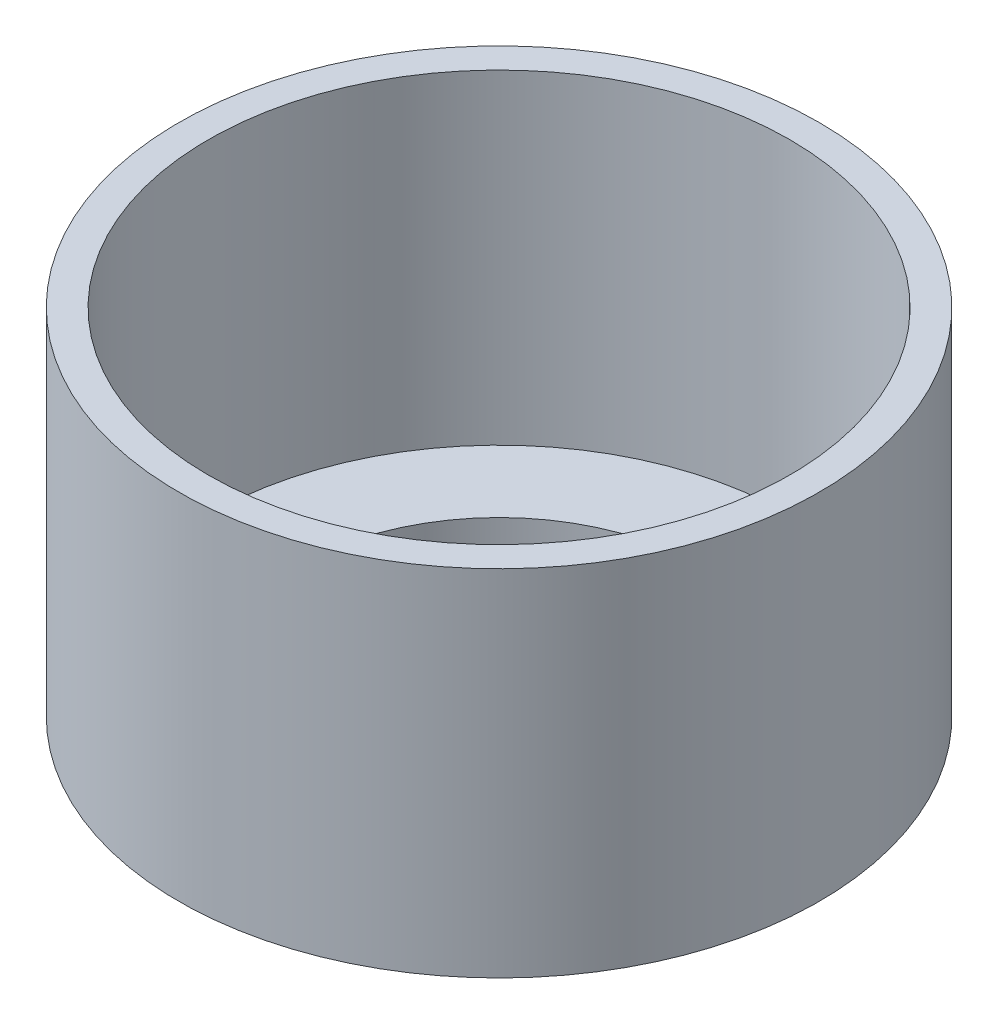
ISO-10303-21;
HEADER;
FILE_DESCRIPTION(('STEP AP214'),'2;1');
FILE_NAME('part.step','',(''),(''),'','','');
FILE_SCHEMA(('AUTOMOTIVE_DESIGN { 1 0 10303 214 1 1 1 1 }'));
ENDSEC;
DATA;
#1=APPLICATION_CONTEXT('core data for automotive mechanical design processes');
#2=APPLICATION_PROTOCOL_DEFINITION('international standard','automotive_design',2000,#1);
#3=PRODUCT_CONTEXT('',#1,'mechanical');
#4=PRODUCT('Part','Part','',(#3));
#5=PRODUCT_RELATED_PRODUCT_CATEGORY('part','',(#4));
#6=PRODUCT_DEFINITION_FORMATION('','',#4);
#7=PRODUCT_DEFINITION_CONTEXT('part definition',#1,'design');
#8=PRODUCT_DEFINITION('design','',#6,#7);
#9=PRODUCT_DEFINITION_SHAPE('','',#8);
#10=(LENGTH_UNIT() NAMED_UNIT(*) SI_UNIT(.MILLI.,.METRE.));
#11=(NAMED_UNIT(*) PLANE_ANGLE_UNIT() SI_UNIT($,.RADIAN.));
#12=(NAMED_UNIT(*) SI_UNIT($,.STERADIAN.) SOLID_ANGLE_UNIT());
#13=UNCERTAINTY_MEASURE_WITH_UNIT(LENGTH_MEASURE(1.E-05),#10,'distance_accuracy_value','');
#14=(GEOMETRIC_REPRESENTATION_CONTEXT(3) GLOBAL_UNCERTAINTY_ASSIGNED_CONTEXT((#13)) GLOBAL_UNIT_ASSIGNED_CONTEXT((#10,
#11,#12)) REPRESENTATION_CONTEXT('',''));
#15=CARTESIAN_POINT('',(0.,0.,0.));
#16=DIRECTION('',(0.,0.,1.));
#17=DIRECTION('',(1.,0.,0.));
#18=AXIS2_PLACEMENT_3D('',#15,#16,#17);
#19=CARTESIAN_POINT('',(0.,76.2,0.));
#20=DIRECTION('',(0.,-1.,0.));
#21=DIRECTION('',(0.,0.,-1.));
#22=AXIS2_PLACEMENT_3D('',#19,#20,#21);
#23=CYLINDRICAL_SURFACE('',#22,68.8419600895685);
#24=CARTESIAN_POINT('',(0.,76.2,0.));
#25=DIRECTION('',(0.,1.,0.));
#26=DIRECTION('',(0.,0.,1.));
#27=AXIS2_PLACEMENT_3D('',#24,#25,#26);
#28=CIRCLE('',#27,68.8419600895685);
#29=CARTESIAN_POINT('',(0.,76.2,-68.8419600895685));
#30=VERTEX_POINT('',#29);
#31=EDGE_CURVE('E11',#30,#30,#28,.T.);
#32=CARTESIAN_POINT('',(0.,0.,0.));
#33=DIRECTION('',(0.,1.,0.));
#34=DIRECTION('',(0.,0.,1.));
#35=AXIS2_PLACEMENT_3D('',#32,#33,#34);
#36=CIRCLE('',#35,68.8419600895685);
#37=CARTESIAN_POINT('',(0.,0.,-68.8419600895685));
#38=VERTEX_POINT('',#37);
#39=EDGE_CURVE('E36',#38,#38,#36,.T.);
#40=CARTESIAN_POINT('',(0.,76.2,-68.8419600895685));
#41=CARTESIAN_POINT('',(0.,75.40625,-68.8419600895685));
#42=CARTESIAN_POINT('',(0.,74.6125,-68.8419600895685));
#43=CARTESIAN_POINT('',(0.,73.025,-68.8419600895685));
#44=CARTESIAN_POINT('',(0.,72.23125,-68.8419600895685));
#45=CARTESIAN_POINT('',(0.,70.64375,-68.8419600895685));
#46=CARTESIAN_POINT('',(0.,69.85,-68.8419600895685));
#47=CARTESIAN_POINT('',(0.,68.2625,-68.8419600895685));
#48=CARTESIAN_POINT('',(0.,67.46875,-68.8419600895685));
#49=CARTESIAN_POINT('',(0.,65.88125,-68.8419600895685));
#50=CARTESIAN_POINT('',(0.,65.0875,-68.8419600895685));
#51=CARTESIAN_POINT('',(0.,63.5,-68.8419600895685));
#52=CARTESIAN_POINT('',(0.,62.70625,-68.8419600895685));
#53=CARTESIAN_POINT('',(0.,61.11875,-68.8419600895685));
#54=CARTESIAN_POINT('',(0.,60.325,-68.8419600895685));
#55=CARTESIAN_POINT('',(0.,58.7375,-68.8419600895685));
#56=CARTESIAN_POINT('',(0.,57.94375,-68.8419600895685));
#57=CARTESIAN_POINT('',(0.,56.35625,-68.8419600895685));
#58=CARTESIAN_POINT('',(0.,55.5625,-68.8419600895685));
#59=CARTESIAN_POINT('',(0.,53.975,-68.8419600895685));
#60=CARTESIAN_POINT('',(0.,53.18125,-68.8419600895685));
#61=CARTESIAN_POINT('',(0.,51.59375,-68.8419600895685));
#62=CARTESIAN_POINT('',(0.,50.8,-68.8419600895685));
#63=CARTESIAN_POINT('',(0.,49.2125,-68.8419600895685));
#64=CARTESIAN_POINT('',(0.,48.41875,-68.8419600895685));
#65=CARTESIAN_POINT('',(0.,46.83125,-68.8419600895685));
#66=CARTESIAN_POINT('',(0.,46.0375,-68.8419600895685));
#67=CARTESIAN_POINT('',(0.,44.45,-68.8419600895685));
#68=CARTESIAN_POINT('',(0.,43.65625,-68.8419600895685));
#69=CARTESIAN_POINT('',(0.,42.06875,-68.8419600895685));
#70=CARTESIAN_POINT('',(0.,41.275,-68.8419600895685));
#71=CARTESIAN_POINT('',(0.,39.6875,-68.8419600895685));
#72=CARTESIAN_POINT('',(0.,38.89375,-68.8419600895685));
#73=CARTESIAN_POINT('',(0.,37.30625,-68.8419600895685));
#74=CARTESIAN_POINT('',(0.,36.5125,-68.8419600895685));
#75=CARTESIAN_POINT('',(0.,34.925,-68.8419600895685));
#76=CARTESIAN_POINT('',(0.,34.13125,-68.8419600895685));
#77=CARTESIAN_POINT('',(0.,32.54375,-68.8419600895685));
#78=CARTESIAN_POINT('',(0.,31.75,-68.8419600895685));
#79=CARTESIAN_POINT('',(0.,30.1625,-68.8419600895685));
#80=CARTESIAN_POINT('',(0.,29.36875,-68.8419600895685));
#81=CARTESIAN_POINT('',(0.,27.78125,-68.8419600895685));
#82=CARTESIAN_POINT('',(0.,26.9875,-68.8419600895685));
#83=CARTESIAN_POINT('',(0.,25.4,-68.8419600895685));
#84=CARTESIAN_POINT('',(0.,24.60625,-68.8419600895685));
#85=CARTESIAN_POINT('',(0.,23.01875,-68.8419600895685));
#86=CARTESIAN_POINT('',(0.,22.225,-68.8419600895685));
#87=CARTESIAN_POINT('',(0.,20.6375,-68.8419600895685));
#88=CARTESIAN_POINT('',(0.,19.84375,-68.8419600895685));
#89=CARTESIAN_POINT('',(0.,18.25625,-68.8419600895685));
#90=CARTESIAN_POINT('',(0.,17.4625,-68.8419600895685));
#91=CARTESIAN_POINT('',(0.,15.875,-68.8419600895685));
#92=CARTESIAN_POINT('',(0.,15.08125,-68.8419600895685));
#93=CARTESIAN_POINT('',(0.,13.49375,-68.8419600895685));
#94=CARTESIAN_POINT('',(0.,12.7,-68.8419600895685));
#95=CARTESIAN_POINT('',(0.,11.1125,-68.8419600895685));
#96=CARTESIAN_POINT('',(0.,10.31875,-68.8419600895685));
#97=CARTESIAN_POINT('',(0.,8.73125,-68.8419600895685));
#98=CARTESIAN_POINT('',(0.,7.93750000000001,-68.8419600895685));
#99=CARTESIAN_POINT('',(0.,6.35,-68.8419600895685));
#100=CARTESIAN_POINT('',(0.,5.55625,-68.8419600895685));
#101=CARTESIAN_POINT('',(0.,3.96875,-68.8419600895685));
#102=CARTESIAN_POINT('',(0.,3.175,-68.8419600895685));
#103=CARTESIAN_POINT('',(0.,1.5875,-68.8419600895685));
#104=CARTESIAN_POINT('',(0.,0.793750000000001,-68.8419600895685));
#105=CARTESIAN_POINT('',(0.,0.,-68.8419600895685));
#106=B_SPLINE_CURVE_WITH_KNOTS('',3,(#40,#41,#42,#43,#44,#45,#46,#47,#48,#49,#50,#51,#52,#53,
#54,#55,#56,#57,#58,#59,#60,#61,#62,#63,#64,#65,#66,#67,#68,#69,#70,#71,#72,#73,#74,#75,#76,#77,
#78,#79,#80,#81,#82,#83,#84,#85,#86,#87,#88,#89,#90,#91,#92,#93,#94,#95,#96,#97,#98,#99,#100,
#101,#102,#103,#104,#105),.UNSPECIFIED.,.F.,.F.,(4,2,2,2,2,2,2,2,2,2,2,2,2,2,2,2,2,2,2,2,2,2,2,
2,2,2,2,2,2,2,2,2,4),(0.,2.38124999999999,4.76249999999999,7.14374999999999,9.52499999999999,
11.90625,14.2875,16.66875,19.05,21.43125,23.8125,26.19375,28.575,30.95625,33.3375,35.71875,38.1,
40.48125,42.8625,45.24375,47.625,50.00625,52.3875,54.76875,57.15,59.53125,61.9125,64.29375,
66.675,69.05625,71.4375,73.81875,76.2),.UNSPECIFIED.);
#107=EDGE_CURVE('BSEAM33',#30,#38,#106,.T.);
#108=ORIENTED_EDGE('',*,*,#31,.F.);
#109=ORIENTED_EDGE('',*,*,#39,.T.);
#110=ORIENTED_EDGE('',*,*,#107,.T.);
#111=ORIENTED_EDGE('',*,*,#107,.F.);
#112=EDGE_LOOP('',(#108,#110,#109,#111));
#113=FACE_BOUND('',#112,.T.);
#114=ADVANCED_FACE('F33',(#113),#23,.T.);
#115=CARTESIAN_POINT('',(0.,76.2,0.));
#116=DIRECTION('',(0.,1.,0.));
#117=DIRECTION('',(0.,0.,1.));
#118=AXIS2_PLACEMENT_3D('',#115,#116,#117);
#119=PLANE('',#118);
#120=CARTESIAN_POINT('',(0.,76.2,0.));
#121=DIRECTION('',(0.,1.,0.));
#122=DIRECTION('',(0.,0.,1.));
#123=AXIS2_PLACEMENT_3D('',#120,#121,#122);
#124=CIRCLE('',#123,62.4919600895685);
#125=CARTESIAN_POINT('',(0.,76.2,62.4919600895685));
#126=VERTEX_POINT('',#125);
#127=EDGE_CURVE('E47',#126,#126,#124,.T.);
#128=ORIENTED_EDGE('',*,*,#127,.F.);
#129=EDGE_LOOP('',(#128));
#130=FACE_BOUND('',#129,.T.);
#131=ORIENTED_EDGE('',*,*,#31,.T.);
#132=EDGE_LOOP('',(#131));
#133=FACE_BOUND('',#132,.T.);
#134=ADVANCED_FACE('F78',(#130,#133),#119,.T.);
#135=CARTESIAN_POINT('',(0.,0.,0.));
#136=DIRECTION('',(0.,1.,0.));
#137=DIRECTION('',(0.,0.,1.));
#138=AXIS2_PLACEMENT_3D('',#135,#136,#137);
#139=PLANE('',#138);
#140=CARTESIAN_POINT('',(0.,0.,0.));
#141=DIRECTION('',(0.,1.,0.));
#142=DIRECTION('',(0.,0.,1.));
#143=AXIS2_PLACEMENT_3D('',#140,#141,#142);
#144=CIRCLE('',#143,43.4419600895685);
#145=CARTESIAN_POINT('',(0.,0.,43.4419600895685));
#146=VERTEX_POINT('',#145);
#147=EDGE_CURVE('E50',#146,#146,#144,.T.);
#148=ORIENTED_EDGE('',*,*,#147,.T.);
#149=EDGE_LOOP('',(#148));
#150=FACE_BOUND('',#149,.T.);
#151=ORIENTED_EDGE('',*,*,#39,.F.);
#152=EDGE_LOOP('',(#151));
#153=FACE_BOUND('',#152,.T.);
#154=ADVANCED_FACE('F57',(#150,#153),#139,.F.);
#155=CARTESIAN_POINT('',(0.,-176.753954995892,0.));
#156=DIRECTION('',(0.,1.,0.));
#157=DIRECTION('',(0.,0.,1.));
#158=AXIS2_PLACEMENT_3D('',#155,#156,#157);
#159=CYLINDRICAL_SURFACE('',#158,62.4919600895685);
#160=CARTESIAN_POINT('',(0.,6.34999999999999,0.));
#161=DIRECTION('',(0.,1.,0.));
#162=DIRECTION('',(0.,0.,1.));
#163=AXIS2_PLACEMENT_3D('',#160,#161,#162);
#164=CIRCLE('',#163,62.4919600895685);
#165=CARTESIAN_POINT('',(0.,6.34999999999999,62.4919600895685));
#166=VERTEX_POINT('',#165);
#167=EDGE_CURVE('E43',#166,#166,#164,.F.);
#168=ORIENTED_EDGE('',*,*,#167,.T.);
#169=EDGE_LOOP('',(#168));
#170=FACE_BOUND('',#169,.T.);
#171=ORIENTED_EDGE('',*,*,#127,.T.);
#172=EDGE_LOOP('',(#171));
#173=FACE_BOUND('',#172,.T.);
#174=ADVANCED_FACE('F69',(#170,#173),#159,.F.);
#175=CARTESIAN_POINT('',(0.,6.35,0.));
#176=DIRECTION('',(0.,1.,0.));
#177=DIRECTION('',(0.,0.,1.));
#178=AXIS2_PLACEMENT_3D('',#175,#176,#177);
#179=PLANE('',#178);
#180=CARTESIAN_POINT('',(0.,6.35,0.));
#181=DIRECTION('',(0.,1.,0.));
#182=DIRECTION('',(0.,0.,1.));
#183=AXIS2_PLACEMENT_3D('',#180,#181,#182);
#184=CIRCLE('',#183,43.4419600895685);
#185=CARTESIAN_POINT('',(0.,6.35,43.4419600895685));
#186=VERTEX_POINT('',#185);
#187=EDGE_CURVE('E51',#186,#186,#184,.T.);
#188=ORIENTED_EDGE('',*,*,#187,.F.);
#189=EDGE_LOOP('',(#188));
#190=FACE_BOUND('',#189,.T.);
#191=ORIENTED_EDGE('',*,*,#167,.F.);
#192=EDGE_LOOP('',(#191));
#193=FACE_BOUND('',#192,.T.);
#194=ADVANCED_FACE('F63',(#190,#193),#179,.T.);
#195=CARTESIAN_POINT('',(0.,0.,0.));
#196=DIRECTION('',(0.,1.,0.));
#197=DIRECTION('',(0.,0.,1.));
#198=AXIS2_PLACEMENT_3D('',#195,#196,#197);
#199=CYLINDRICAL_SURFACE('',#198,43.4419600895685);
#200=ORIENTED_EDGE('',*,*,#147,.F.);
#201=EDGE_LOOP('',(#200));
#202=FACE_BOUND('',#201,.T.);
#203=ORIENTED_EDGE('',*,*,#187,.T.);
#204=EDGE_LOOP('',(#203));
#205=FACE_BOUND('',#204,.T.);
#206=ADVANCED_FACE('F60',(#202,#205),#199,.F.);
#207=CLOSED_SHELL('',(#114,#134,#154,#174,#194,#206));
#208=MANIFOLD_SOLID_BREP('B2',#207);
#209=ADVANCED_BREP_SHAPE_REPRESENTATION('',(#18,#208),#14);
#210=SHAPE_DEFINITION_REPRESENTATION(#9,#209);
ENDSEC;
END-ISO-10303-21;
